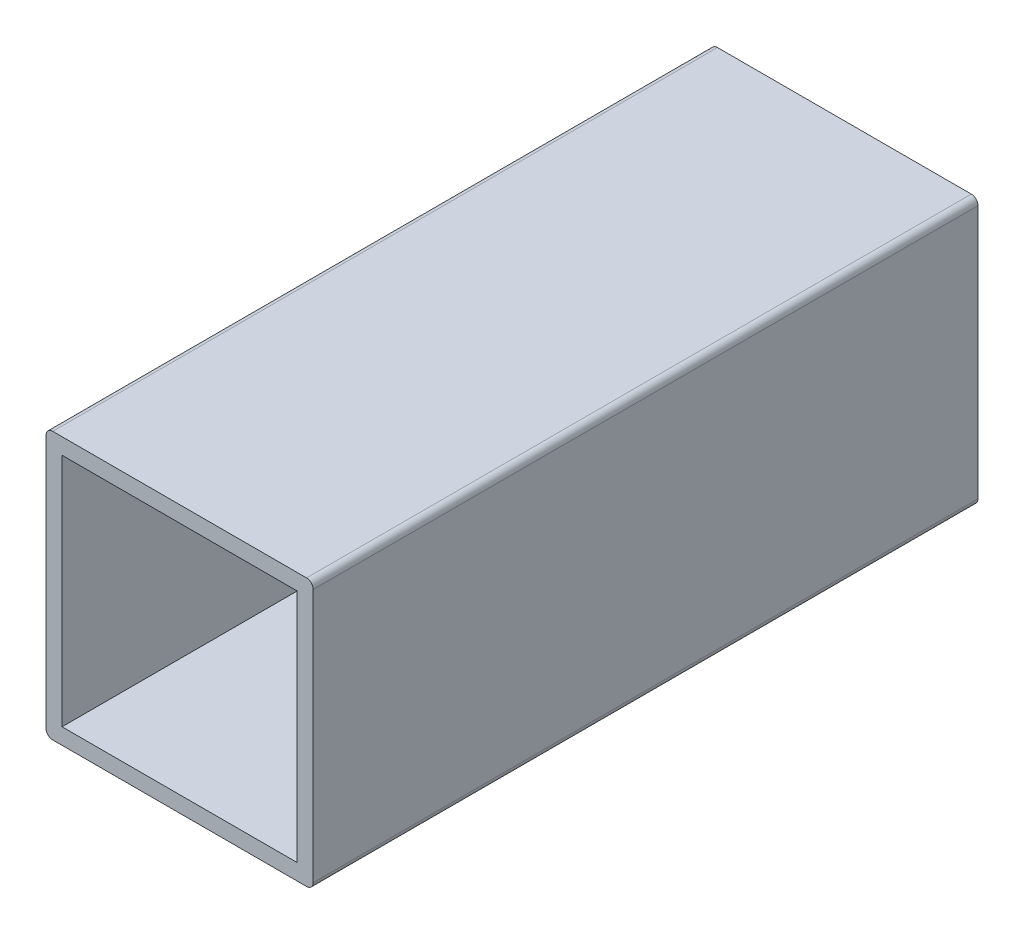
ISO-10303-21;
HEADER;
FILE_DESCRIPTION(('STEP AP214'),'2;1');
FILE_NAME('part.step','',(''),(''),'','','');
FILE_SCHEMA(('AUTOMOTIVE_DESIGN { 1 0 10303 214 1 1 1 1 }'));
ENDSEC;
DATA;
#1=APPLICATION_CONTEXT('core data for automotive mechanical design processes');
#2=APPLICATION_PROTOCOL_DEFINITION('international standard','automotive_design',2000,#1);
#3=PRODUCT_CONTEXT('',#1,'mechanical');
#4=PRODUCT('Part','Part','',(#3));
#5=PRODUCT_RELATED_PRODUCT_CATEGORY('part','',(#4));
#6=PRODUCT_DEFINITION_FORMATION('','',#4);
#7=PRODUCT_DEFINITION_CONTEXT('part definition',#1,'design');
#8=PRODUCT_DEFINITION('design','',#6,#7);
#9=PRODUCT_DEFINITION_SHAPE('','',#8);
#10=(LENGTH_UNIT() NAMED_UNIT(*) SI_UNIT(.MILLI.,.METRE.));
#11=(NAMED_UNIT(*) PLANE_ANGLE_UNIT() SI_UNIT($,.RADIAN.));
#12=(NAMED_UNIT(*) SI_UNIT($,.STERADIAN.) SOLID_ANGLE_UNIT());
#13=UNCERTAINTY_MEASURE_WITH_UNIT(LENGTH_MEASURE(1.E-05),#10,'distance_accuracy_value','');
#14=(GEOMETRIC_REPRESENTATION_CONTEXT(3) GLOBAL_UNCERTAINTY_ASSIGNED_CONTEXT((#13)) GLOBAL_UNIT_ASSIGNED_CONTEXT((#10,
#11,#12)) REPRESENTATION_CONTEXT('',''));
#15=CARTESIAN_POINT('',(0.,0.,0.));
#16=DIRECTION('',(0.,0.,1.));
#17=DIRECTION('',(1.,0.,0.));
#18=AXIS2_PLACEMENT_3D('',#15,#16,#17);
#19=CARTESIAN_POINT('',(-38.,-38.,-99.5));
#20=DIRECTION('',(0.,0.,1.));
#21=DIRECTION('',(1.,0.,0.));
#22=AXIS2_PLACEMENT_3D('',#19,#20,#21);
#23=CYLINDRICAL_SURFACE('',#22,2.);
#24=CARTESIAN_POINT('',(-38.,-38.,99.5));
#25=DIRECTION('',(0.,0.,1.));
#26=DIRECTION('',(1.,0.,0.));
#27=AXIS2_PLACEMENT_3D('',#24,#25,#26);
#28=CIRCLE('',#27,2.);
#29=CARTESIAN_POINT('',(-40.,-38.,99.5));
#30=VERTEX_POINT('',#29);
#31=CARTESIAN_POINT('',(-38.,-40.,99.5));
#32=VERTEX_POINT('',#31);
#33=EDGE_CURVE('E161',#30,#32,#28,.T.);
#34=ORIENTED_EDGE('',*,*,#33,.F.);
#35=DIRECTION('',(0.,0.,1.));
#36=VECTOR('',#35,1.);
#37=CARTESIAN_POINT('',(-40.,-38.,-99.5));
#38=LINE('',#37,#36);
#39=CARTESIAN_POINT('',(-40.,-38.,-99.5));
#40=VERTEX_POINT('',#39);
#41=EDGE_CURVE('E11',#40,#30,#38,.T.);
#42=ORIENTED_EDGE('',*,*,#41,.F.);
#43=CARTESIAN_POINT('',(-38.,-38.,-99.5));
#44=DIRECTION('',(0.,0.,1.));
#45=DIRECTION('',(1.,0.,0.));
#46=AXIS2_PLACEMENT_3D('',#43,#44,#45);
#47=CIRCLE('',#46,2.);
#48=CARTESIAN_POINT('',(-38.,-40.,-99.5));
#49=VERTEX_POINT('',#48);
#50=EDGE_CURVE('E165',#40,#49,#47,.T.);
#51=ORIENTED_EDGE('',*,*,#50,.T.);
#52=DIRECTION('',(0.,0.,1.));
#53=VECTOR('',#52,1.);
#54=CARTESIAN_POINT('',(-38.,-40.,-99.5));
#55=LINE('',#54,#53);
#56=EDGE_CURVE('E42',#49,#32,#55,.T.);
#57=ORIENTED_EDGE('',*,*,#56,.T.);
#58=EDGE_LOOP('',(#34,#42,#51,#57));
#59=FACE_BOUND('',#58,.T.);
#60=ADVANCED_FACE('F39',(#59),#23,.T.);
#61=CARTESIAN_POINT('',(-40.,-38.,-99.5));
#62=DIRECTION('',(-1.,0.,0.));
#63=DIRECTION('',(0.,0.,1.));
#64=AXIS2_PLACEMENT_3D('',#61,#62,#63);
#65=PLANE('',#64);
#66=DIRECTION('',(0.,-1.,0.));
#67=VECTOR('',#66,1.);
#68=CARTESIAN_POINT('',(-40.,-38.,99.5));
#69=LINE('',#68,#67);
#70=CARTESIAN_POINT('',(-40.,38.,99.5));
#71=VERTEX_POINT('',#70);
#72=EDGE_CURVE('E169',#71,#30,#69,.T.);
#73=ORIENTED_EDGE('',*,*,#72,.F.);
#74=DIRECTION('',(0.,0.,1.));
#75=VECTOR('',#74,1.);
#76=CARTESIAN_POINT('',(-40.,38.,-99.5));
#77=LINE('',#76,#75);
#78=CARTESIAN_POINT('',(-40.,38.,-99.5));
#79=VERTEX_POINT('',#78);
#80=EDGE_CURVE('E47',#79,#71,#77,.T.);
#81=ORIENTED_EDGE('',*,*,#80,.F.);
#82=DIRECTION('',(0.,-1.,0.));
#83=VECTOR('',#82,1.);
#84=CARTESIAN_POINT('',(-40.,-38.,-99.5));
#85=LINE('',#84,#83);
#86=EDGE_CURVE('E187',#79,#40,#85,.T.);
#87=ORIENTED_EDGE('',*,*,#86,.T.);
#88=ORIENTED_EDGE('',*,*,#41,.T.);
#89=EDGE_LOOP('',(#73,#81,#87,#88));
#90=FACE_BOUND('',#89,.T.);
#91=ADVANCED_FACE('F234',(#90),#65,.T.);
#92=CARTESIAN_POINT('',(-38.,38.,-99.5));
#93=DIRECTION('',(0.,0.,1.));
#94=DIRECTION('',(1.,0.,0.));
#95=AXIS2_PLACEMENT_3D('',#92,#93,#94);
#96=CYLINDRICAL_SURFACE('',#95,2.);
#97=CARTESIAN_POINT('',(-38.,38.,99.5));
#98=DIRECTION('',(0.,0.,1.));
#99=DIRECTION('',(1.,0.,0.));
#100=AXIS2_PLACEMENT_3D('',#97,#98,#99);
#101=CIRCLE('',#100,2.);
#102=CARTESIAN_POINT('',(-38.,40.,99.5));
#103=VERTEX_POINT('',#102);
#104=EDGE_CURVE('E207',#103,#71,#101,.T.);
#105=ORIENTED_EDGE('',*,*,#104,.F.);
#106=DIRECTION('',(0.,0.,1.));
#107=VECTOR('',#106,1.);
#108=CARTESIAN_POINT('',(-38.,40.,-99.5));
#109=LINE('',#108,#107);
#110=CARTESIAN_POINT('',(-38.,40.,-99.5));
#111=VERTEX_POINT('',#110);
#112=EDGE_CURVE('E213',#111,#103,#109,.T.);
#113=ORIENTED_EDGE('',*,*,#112,.F.);
#114=CARTESIAN_POINT('',(-38.,38.,-99.5));
#115=DIRECTION('',(0.,0.,1.));
#116=DIRECTION('',(1.,0.,0.));
#117=AXIS2_PLACEMENT_3D('',#114,#115,#116);
#118=CIRCLE('',#117,2.);
#119=EDGE_CURVE('E184',#111,#79,#118,.T.);
#120=ORIENTED_EDGE('',*,*,#119,.T.);
#121=ORIENTED_EDGE('',*,*,#80,.T.);
#122=EDGE_LOOP('',(#105,#113,#120,#121));
#123=FACE_BOUND('',#122,.T.);
#124=ADVANCED_FACE('F253',(#123),#96,.T.);
#125=CARTESIAN_POINT('',(-38.,40.,-99.5));
#126=DIRECTION('',(0.,1.,0.));
#127=DIRECTION('',(0.,0.,1.));
#128=AXIS2_PLACEMENT_3D('',#125,#126,#127);
#129=PLANE('',#128);
#130=DIRECTION('',(-1.,0.,0.));
#131=VECTOR('',#130,1.);
#132=CARTESIAN_POINT('',(-38.,40.,99.5));
#133=LINE('',#132,#131);
#134=CARTESIAN_POINT('',(38.,40.,99.5));
#135=VERTEX_POINT('',#134);
#136=EDGE_CURVE('E204',#135,#103,#133,.T.);
#137=ORIENTED_EDGE('',*,*,#136,.F.);
#138=DIRECTION('',(0.,0.,1.));
#139=VECTOR('',#138,1.);
#140=CARTESIAN_POINT('',(38.,40.,-99.5));
#141=LINE('',#140,#139);
#142=CARTESIAN_POINT('',(38.,40.,-99.5));
#143=VERTEX_POINT('',#142);
#144=EDGE_CURVE('E215',#143,#135,#141,.T.);
#145=ORIENTED_EDGE('',*,*,#144,.F.);
#146=DIRECTION('',(-1.,0.,0.));
#147=VECTOR('',#146,1.);
#148=CARTESIAN_POINT('',(-38.,40.,-99.5));
#149=LINE('',#148,#147);
#150=EDGE_CURVE('E181',#143,#111,#149,.T.);
#151=ORIENTED_EDGE('',*,*,#150,.T.);
#152=ORIENTED_EDGE('',*,*,#112,.T.);
#153=EDGE_LOOP('',(#137,#145,#151,#152));
#154=FACE_BOUND('',#153,.T.);
#155=ADVANCED_FACE('F251',(#154),#129,.T.);
#156=CARTESIAN_POINT('',(38.,38.,-99.5));
#157=DIRECTION('',(0.,0.,1.));
#158=DIRECTION('',(1.,0.,0.));
#159=AXIS2_PLACEMENT_3D('',#156,#157,#158);
#160=CYLINDRICAL_SURFACE('',#159,2.);
#161=CARTESIAN_POINT('',(38.,38.,99.5));
#162=DIRECTION('',(0.,0.,1.));
#163=DIRECTION('',(-1.,0.,0.));
#164=AXIS2_PLACEMENT_3D('',#161,#162,#163);
#165=CIRCLE('',#164,2.);
#166=CARTESIAN_POINT('',(40.,38.,99.5));
#167=VERTEX_POINT('',#166);
#168=EDGE_CURVE('E201',#167,#135,#165,.T.);
#169=ORIENTED_EDGE('',*,*,#168,.F.);
#170=DIRECTION('',(0.,0.,1.));
#171=VECTOR('',#170,1.);
#172=CARTESIAN_POINT('',(40.,38.,-99.5));
#173=LINE('',#172,#171);
#174=CARTESIAN_POINT('',(40.,38.,-99.5));
#175=VERTEX_POINT('',#174);
#176=EDGE_CURVE('E217',#175,#167,#173,.T.);
#177=ORIENTED_EDGE('',*,*,#176,.F.);
#178=CARTESIAN_POINT('',(38.,38.,-99.5));
#179=DIRECTION('',(0.,0.,1.));
#180=DIRECTION('',(-1.,0.,0.));
#181=AXIS2_PLACEMENT_3D('',#178,#179,#180);
#182=CIRCLE('',#181,2.);
#183=EDGE_CURVE('E178',#175,#143,#182,.T.);
#184=ORIENTED_EDGE('',*,*,#183,.T.);
#185=ORIENTED_EDGE('',*,*,#144,.T.);
#186=EDGE_LOOP('',(#169,#177,#184,#185));
#187=FACE_BOUND('',#186,.T.);
#188=ADVANCED_FACE('F247',(#187),#160,.T.);
#189=CARTESIAN_POINT('',(40.,-38.,-99.5));
#190=DIRECTION('',(1.,0.,0.));
#191=DIRECTION('',(0.,0.,-1.));
#192=AXIS2_PLACEMENT_3D('',#189,#190,#191);
#193=PLANE('',#192);
#194=DIRECTION('',(0.,1.,0.));
#195=VECTOR('',#194,1.);
#196=CARTESIAN_POINT('',(40.,-38.,99.5));
#197=LINE('',#196,#195);
#198=CARTESIAN_POINT('',(40.,-38.,99.5));
#199=VERTEX_POINT('',#198);
#200=EDGE_CURVE('E198',#199,#167,#197,.T.);
#201=ORIENTED_EDGE('',*,*,#200,.F.);
#202=DIRECTION('',(0.,0.,1.));
#203=VECTOR('',#202,1.);
#204=CARTESIAN_POINT('',(40.,-38.,-99.5));
#205=LINE('',#204,#203);
#206=CARTESIAN_POINT('',(40.,-38.,-99.5));
#207=VERTEX_POINT('',#206);
#208=EDGE_CURVE('E219',#207,#199,#205,.T.);
#209=ORIENTED_EDGE('',*,*,#208,.F.);
#210=DIRECTION('',(0.,1.,0.));
#211=VECTOR('',#210,1.);
#212=CARTESIAN_POINT('',(40.,-38.,-99.5));
#213=LINE('',#212,#211);
#214=EDGE_CURVE('E175',#207,#175,#213,.T.);
#215=ORIENTED_EDGE('',*,*,#214,.T.);
#216=ORIENTED_EDGE('',*,*,#176,.T.);
#217=EDGE_LOOP('',(#201,#209,#215,#216));
#218=FACE_BOUND('',#217,.T.);
#219=ADVANCED_FACE('F245',(#218),#193,.T.);
#220=CARTESIAN_POINT('',(38.,-38.,-99.5));
#221=DIRECTION('',(0.,0.,1.));
#222=DIRECTION('',(1.,0.,0.));
#223=AXIS2_PLACEMENT_3D('',#220,#221,#222);
#224=CYLINDRICAL_SURFACE('',#223,2.);
#225=CARTESIAN_POINT('',(38.,-38.,99.5));
#226=DIRECTION('',(0.,0.,1.));
#227=DIRECTION('',(1.,0.,0.));
#228=AXIS2_PLACEMENT_3D('',#225,#226,#227);
#229=CIRCLE('',#228,2.);
#230=CARTESIAN_POINT('',(38.,-40.,99.5));
#231=VERTEX_POINT('',#230);
#232=EDGE_CURVE('E195',#231,#199,#229,.T.);
#233=ORIENTED_EDGE('',*,*,#232,.F.);
#234=DIRECTION('',(0.,0.,1.));
#235=VECTOR('',#234,1.);
#236=CARTESIAN_POINT('',(38.,-40.,-99.5));
#237=LINE('',#236,#235);
#238=CARTESIAN_POINT('',(38.,-40.,-99.5));
#239=VERTEX_POINT('',#238);
#240=EDGE_CURVE('E220',#239,#231,#237,.T.);
#241=ORIENTED_EDGE('',*,*,#240,.F.);
#242=CARTESIAN_POINT('',(38.,-38.,-99.5));
#243=DIRECTION('',(0.,0.,1.));
#244=DIRECTION('',(1.,0.,0.));
#245=AXIS2_PLACEMENT_3D('',#242,#243,#244);
#246=CIRCLE('',#245,2.);
#247=EDGE_CURVE('E172',#239,#207,#246,.T.);
#248=ORIENTED_EDGE('',*,*,#247,.T.);
#249=ORIENTED_EDGE('',*,*,#208,.T.);
#250=EDGE_LOOP('',(#233,#241,#248,#249));
#251=FACE_BOUND('',#250,.T.);
#252=ADVANCED_FACE('F241',(#251),#224,.T.);
#253=CARTESIAN_POINT('',(-38.,-40.,-99.5));
#254=DIRECTION('',(0.,-1.,0.));
#255=DIRECTION('',(0.,0.,-1.));
#256=AXIS2_PLACEMENT_3D('',#253,#254,#255);
#257=PLANE('',#256);
#258=DIRECTION('',(1.,0.,0.));
#259=VECTOR('',#258,1.);
#260=CARTESIAN_POINT('',(-38.,-40.,99.5));
#261=LINE('',#260,#259);
#262=EDGE_CURVE('E192',#32,#231,#261,.T.);
#263=ORIENTED_EDGE('',*,*,#262,.F.);
#264=ORIENTED_EDGE('',*,*,#56,.F.);
#265=DIRECTION('',(1.,0.,0.));
#266=VECTOR('',#265,1.);
#267=CARTESIAN_POINT('',(-38.,-40.,-99.5));
#268=LINE('',#267,#266);
#269=EDGE_CURVE('E168',#49,#239,#268,.T.);
#270=ORIENTED_EDGE('',*,*,#269,.T.);
#271=ORIENTED_EDGE('',*,*,#240,.T.);
#272=EDGE_LOOP('',(#263,#264,#270,#271));
#273=FACE_BOUND('',#272,.T.);
#274=ADVANCED_FACE('F228',(#273),#257,.T.);
#275=CARTESIAN_POINT('',(-38.,-38.,-99.5));
#276=DIRECTION('',(0.,0.,1.));
#277=DIRECTION('',(1.,0.,0.));
#278=AXIS2_PLACEMENT_3D('',#275,#276,#277);
#279=PLANE('',#278);
#280=DIRECTION('',(-1.,0.,0.));
#281=VECTOR('',#280,1.);
#282=CARTESIAN_POINT('',(-35.2,35.2,-99.5));
#283=LINE('',#282,#281);
#284=CARTESIAN_POINT('',(35.2,35.2,-99.5));
#285=VERTEX_POINT('',#284);
#286=CARTESIAN_POINT('',(-35.2,35.2,-99.5));
#287=VERTEX_POINT('',#286);
#288=EDGE_CURVE('E136',#285,#287,#283,.T.);
#289=ORIENTED_EDGE('',*,*,#288,.T.);
#290=DIRECTION('',(0.,-1.,0.));
#291=VECTOR('',#290,1.);
#292=CARTESIAN_POINT('',(-35.2,-35.2,-99.5));
#293=LINE('',#292,#291);
#294=CARTESIAN_POINT('',(-35.2,-35.2,-99.5));
#295=VERTEX_POINT('',#294);
#296=EDGE_CURVE('E130',#287,#295,#293,.T.);
#297=ORIENTED_EDGE('',*,*,#296,.T.);
#298=DIRECTION('',(1.,0.,0.));
#299=VECTOR('',#298,1.);
#300=CARTESIAN_POINT('',(-35.2,-35.2,-99.5));
#301=LINE('',#300,#299);
#302=CARTESIAN_POINT('',(35.2,-35.2,-99.5));
#303=VERTEX_POINT('',#302);
#304=EDGE_CURVE('E139',#295,#303,#301,.T.);
#305=ORIENTED_EDGE('',*,*,#304,.T.);
#306=DIRECTION('',(0.,1.,0.));
#307=VECTOR('',#306,1.);
#308=CARTESIAN_POINT('',(35.2,-35.2,-99.5));
#309=LINE('',#308,#307);
#310=EDGE_CURVE('E55',#303,#285,#309,.T.);
#311=ORIENTED_EDGE('',*,*,#310,.T.);
#312=EDGE_LOOP('',(#289,#297,#305,#311));
#313=FACE_BOUND('',#312,.T.);
#314=ORIENTED_EDGE('',*,*,#50,.F.);
#315=ORIENTED_EDGE('',*,*,#86,.F.);
#316=ORIENTED_EDGE('',*,*,#119,.F.);
#317=ORIENTED_EDGE('',*,*,#150,.F.);
#318=ORIENTED_EDGE('',*,*,#183,.F.);
#319=ORIENTED_EDGE('',*,*,#214,.F.);
#320=ORIENTED_EDGE('',*,*,#247,.F.);
#321=ORIENTED_EDGE('',*,*,#269,.F.);
#322=EDGE_LOOP('',(#314,#315,#316,#317,#318,#319,#320,#321));
#323=FACE_BOUND('',#322,.T.);
#324=ADVANCED_FACE('F143',(#313,#323),#279,.F.);
#325=CARTESIAN_POINT('',(-38.,-38.,99.5));
#326=DIRECTION('',(0.,0.,1.));
#327=DIRECTION('',(1.,0.,0.));
#328=AXIS2_PLACEMENT_3D('',#325,#326,#327);
#329=PLANE('',#328);
#330=DIRECTION('',(0.,-1.,0.));
#331=VECTOR('',#330,1.);
#332=CARTESIAN_POINT('',(-35.2,-35.2,99.5));
#333=LINE('',#332,#331);
#334=CARTESIAN_POINT('',(-35.2,35.2,99.5));
#335=VERTEX_POINT('',#334);
#336=CARTESIAN_POINT('',(-35.2,-35.2,99.5));
#337=VERTEX_POINT('',#336);
#338=EDGE_CURVE('E63',#335,#337,#333,.T.);
#339=ORIENTED_EDGE('',*,*,#338,.F.);
#340=DIRECTION('',(-1.,0.,0.));
#341=VECTOR('',#340,1.);
#342=CARTESIAN_POINT('',(-35.2,35.2,99.5));
#343=LINE('',#342,#341);
#344=CARTESIAN_POINT('',(35.2,35.2,99.5));
#345=VERTEX_POINT('',#344);
#346=EDGE_CURVE('E146',#345,#335,#343,.T.);
#347=ORIENTED_EDGE('',*,*,#346,.F.);
#348=DIRECTION('',(0.,1.,0.));
#349=VECTOR('',#348,1.);
#350=CARTESIAN_POINT('',(35.2,-35.2,99.5));
#351=LINE('',#350,#349);
#352=CARTESIAN_POINT('',(35.2,-35.2,99.5));
#353=VERTEX_POINT('',#352);
#354=EDGE_CURVE('E149',#353,#345,#351,.T.);
#355=ORIENTED_EDGE('',*,*,#354,.F.);
#356=DIRECTION('',(1.,0.,0.));
#357=VECTOR('',#356,1.);
#358=CARTESIAN_POINT('',(-35.2,-35.2,99.5));
#359=LINE('',#358,#357);
#360=EDGE_CURVE('E155',#337,#353,#359,.T.);
#361=ORIENTED_EDGE('',*,*,#360,.F.);
#362=EDGE_LOOP('',(#339,#347,#355,#361));
#363=FACE_BOUND('',#362,.T.);
#364=ORIENTED_EDGE('',*,*,#33,.T.);
#365=ORIENTED_EDGE('',*,*,#262,.T.);
#366=ORIENTED_EDGE('',*,*,#232,.T.);
#367=ORIENTED_EDGE('',*,*,#200,.T.);
#368=ORIENTED_EDGE('',*,*,#168,.T.);
#369=ORIENTED_EDGE('',*,*,#136,.T.);
#370=ORIENTED_EDGE('',*,*,#104,.T.);
#371=ORIENTED_EDGE('',*,*,#72,.T.);
#372=EDGE_LOOP('',(#364,#365,#366,#367,#368,#369,#370,#371));
#373=FACE_BOUND('',#372,.T.);
#374=ADVANCED_FACE('F230',(#363,#373),#329,.T.);
#375=CARTESIAN_POINT('',(-35.2,-35.2,-99.5));
#376=DIRECTION('',(-1.,0.,0.));
#377=DIRECTION('',(0.,0.,1.));
#378=AXIS2_PLACEMENT_3D('',#375,#376,#377);
#379=PLANE('',#378);
#380=ORIENTED_EDGE('',*,*,#338,.T.);
#381=DIRECTION('',(0.,0.,1.));
#382=VECTOR('',#381,1.);
#383=CARTESIAN_POINT('',(-35.2,-35.2,-99.5));
#384=LINE('',#383,#382);
#385=EDGE_CURVE('E126',#295,#337,#384,.T.);
#386=ORIENTED_EDGE('',*,*,#385,.F.);
#387=ORIENTED_EDGE('',*,*,#296,.F.);
#388=DIRECTION('',(0.,0.,1.));
#389=VECTOR('',#388,1.);
#390=CARTESIAN_POINT('',(-35.2,35.2,-99.5));
#391=LINE('',#390,#389);
#392=EDGE_CURVE('E159',#287,#335,#391,.T.);
#393=ORIENTED_EDGE('',*,*,#392,.T.);
#394=EDGE_LOOP('',(#380,#386,#387,#393));
#395=FACE_BOUND('',#394,.T.);
#396=ADVANCED_FACE('F128',(#395),#379,.F.);
#397=CARTESIAN_POINT('',(-35.2,35.2,-99.5));
#398=DIRECTION('',(0.,1.,0.));
#399=DIRECTION('',(0.,0.,1.));
#400=AXIS2_PLACEMENT_3D('',#397,#398,#399);
#401=PLANE('',#400);
#402=ORIENTED_EDGE('',*,*,#346,.T.);
#403=ORIENTED_EDGE('',*,*,#392,.F.);
#404=ORIENTED_EDGE('',*,*,#288,.F.);
#405=DIRECTION('',(0.,0.,1.));
#406=VECTOR('',#405,1.);
#407=CARTESIAN_POINT('',(35.2,35.2,-99.5));
#408=LINE('',#407,#406);
#409=EDGE_CURVE('E162',#285,#345,#408,.T.);
#410=ORIENTED_EDGE('',*,*,#409,.T.);
#411=EDGE_LOOP('',(#402,#403,#404,#410));
#412=FACE_BOUND('',#411,.T.);
#413=ADVANCED_FACE('F338',(#412),#401,.F.);
#414=CARTESIAN_POINT('',(35.2,-35.2,-99.5));
#415=DIRECTION('',(1.,0.,0.));
#416=DIRECTION('',(0.,0.,-1.));
#417=AXIS2_PLACEMENT_3D('',#414,#415,#416);
#418=PLANE('',#417);
#419=ORIENTED_EDGE('',*,*,#354,.T.);
#420=ORIENTED_EDGE('',*,*,#409,.F.);
#421=ORIENTED_EDGE('',*,*,#310,.F.);
#422=DIRECTION('',(0.,0.,1.));
#423=VECTOR('',#422,1.);
#424=CARTESIAN_POINT('',(35.2,-35.2,-99.5));
#425=LINE('',#424,#423);
#426=EDGE_CURVE('E135',#303,#353,#425,.T.);
#427=ORIENTED_EDGE('',*,*,#426,.T.);
#428=EDGE_LOOP('',(#419,#420,#421,#427));
#429=FACE_BOUND('',#428,.T.);
#430=ADVANCED_FACE('F347',(#429),#418,.F.);
#431=CARTESIAN_POINT('',(-35.2,-35.2,-99.5));
#432=DIRECTION('',(0.,-1.,0.));
#433=DIRECTION('',(0.,0.,-1.));
#434=AXIS2_PLACEMENT_3D('',#431,#432,#433);
#435=PLANE('',#434);
#436=ORIENTED_EDGE('',*,*,#360,.T.);
#437=ORIENTED_EDGE('',*,*,#426,.F.);
#438=ORIENTED_EDGE('',*,*,#304,.F.);
#439=ORIENTED_EDGE('',*,*,#385,.T.);
#440=EDGE_LOOP('',(#436,#437,#438,#439));
#441=FACE_BOUND('',#440,.T.);
#442=ADVANCED_FACE('F140',(#441),#435,.F.);
#443=CLOSED_SHELL('',(#60,#91,#124,#155,#188,#219,#252,#274,#324,#374,#396,#413,#430,#442));
#444=MANIFOLD_SOLID_BREP('B2',#443);
#445=ADVANCED_BREP_SHAPE_REPRESENTATION('',(#18,#444),#14);
#446=SHAPE_DEFINITION_REPRESENTATION(#9,#445);
ENDSEC;
END-ISO-10303-21;
